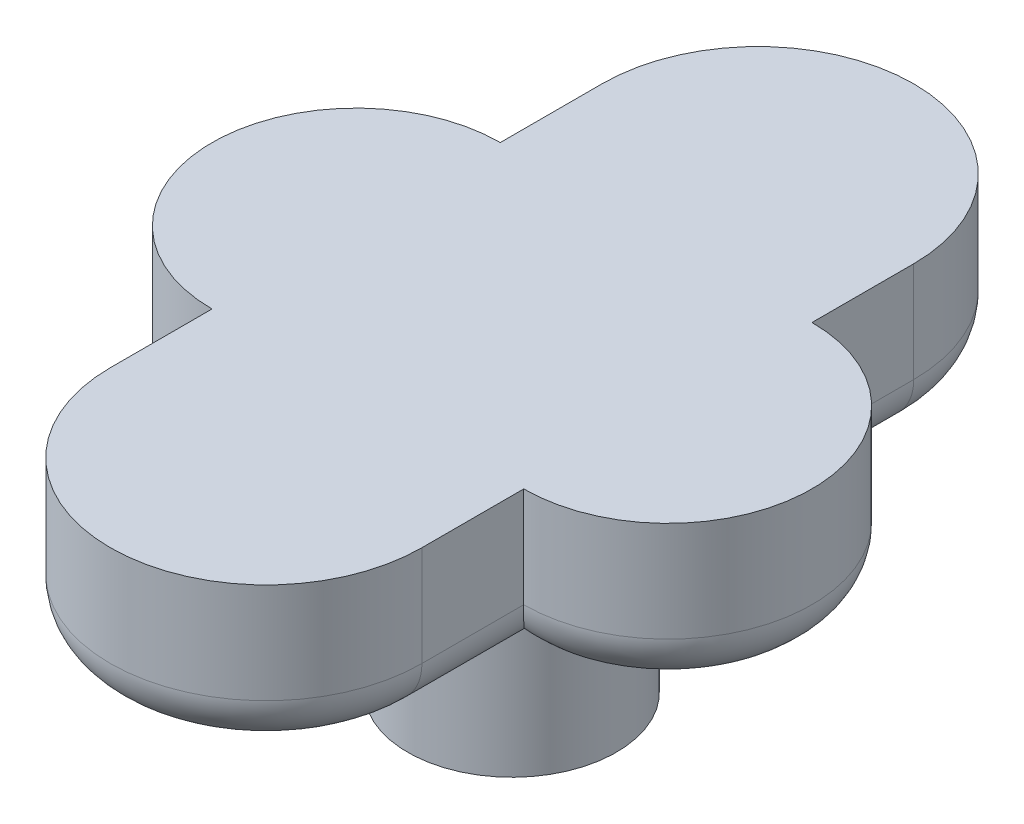
ISO-10303-21;
HEADER;
FILE_DESCRIPTION(('STEP AP214'),'2;1');
FILE_NAME('part.step','',(''),(''),'','','');
FILE_SCHEMA(('AUTOMOTIVE_DESIGN { 1 0 10303 214 1 1 1 1 }'));
ENDSEC;
DATA;
#1=APPLICATION_CONTEXT('core data for automotive mechanical design processes');
#2=APPLICATION_PROTOCOL_DEFINITION('international standard','automotive_design',2000,#1);
#3=PRODUCT_CONTEXT('',#1,'mechanical');
#4=PRODUCT('Part','Part','',(#3));
#5=PRODUCT_RELATED_PRODUCT_CATEGORY('part','',(#4));
#6=PRODUCT_DEFINITION_FORMATION('','',#4);
#7=PRODUCT_DEFINITION_CONTEXT('part definition',#1,'design');
#8=PRODUCT_DEFINITION('design','',#6,#7);
#9=PRODUCT_DEFINITION_SHAPE('','',#8);
#10=(LENGTH_UNIT() NAMED_UNIT(*) SI_UNIT(.MILLI.,.METRE.));
#11=(NAMED_UNIT(*) PLANE_ANGLE_UNIT() SI_UNIT($,.RADIAN.));
#12=(NAMED_UNIT(*) SI_UNIT($,.STERADIAN.) SOLID_ANGLE_UNIT());
#13=UNCERTAINTY_MEASURE_WITH_UNIT(LENGTH_MEASURE(1.E-05),#10,'distance_accuracy_value','');
#14=(GEOMETRIC_REPRESENTATION_CONTEXT(3) GLOBAL_UNCERTAINTY_ASSIGNED_CONTEXT((#13)) GLOBAL_UNIT_ASSIGNED_CONTEXT((#10,
#11,#12)) REPRESENTATION_CONTEXT('',''));
#15=CARTESIAN_POINT('',(0.,0.,0.));
#16=DIRECTION('',(0.,0.,1.));
#17=DIRECTION('',(1.,0.,0.));
#18=AXIS2_PLACEMENT_3D('',#15,#16,#17);
#19=CARTESIAN_POINT('',(35.1316045655547,30.,9.81329346127429));
#20=DIRECTION('',(0.,-1.,0.));
#21=DIRECTION('',(0.,0.,-1.));
#22=AXIS2_PLACEMENT_3D('',#19,#20,#21);
#23=CYLINDRICAL_SURFACE('',#22,28.7397572124763);
#24=DIRECTION('',(0.,-1.,0.));
#25=VECTOR('',#24,1.);
#26=CARTESIAN_POINT('',(35.1316045655547,30.,-18.926463751202));
#27=LINE('',#26,#25);
#28=CARTESIAN_POINT('',(35.1316045655547,30.,-18.926463751202));
#29=VERTEX_POINT('',#28);
#30=CARTESIAN_POINT('',(35.1316045655547,10.,-18.926463751202));
#31=VERTEX_POINT('',#30);
#32=EDGE_CURVE('E334',#29,#31,#27,.T.);
#33=ORIENTED_EDGE('',*,*,#32,.T.);
#34=CARTESIAN_POINT('',(35.1316045655547,10.,9.81329346127429));
#35=DIRECTION('',(0.,-1.,0.));
#36=DIRECTION('',(0.,0.,-1.));
#37=AXIS2_PLACEMENT_3D('',#34,#35,#36);
#38=CIRCLE('',#37,28.7397572124763);
#39=CARTESIAN_POINT('',(35.1316045655547,10.,38.5530506737506));
#40=VERTEX_POINT('',#39);
#41=EDGE_CURVE('E150',#31,#40,#38,.F.);
#42=ORIENTED_EDGE('',*,*,#41,.T.);
#43=DIRECTION('',(0.,-1.,0.));
#44=VECTOR('',#43,1.);
#45=CARTESIAN_POINT('',(35.1316045655547,30.,38.5530506737506));
#46=LINE('',#45,#44);
#47=CARTESIAN_POINT('',(35.1316045655547,30.,38.5530506737506));
#48=VERTEX_POINT('',#47);
#49=EDGE_CURVE('E131',#48,#40,#46,.T.);
#50=ORIENTED_EDGE('',*,*,#49,.F.);
#51=CARTESIAN_POINT('',(35.1316045655547,30.,9.81329346127429));
#52=DIRECTION('',(0.,1.,0.));
#53=DIRECTION('',(0.,0.,-1.));
#54=AXIS2_PLACEMENT_3D('',#51,#52,#53);
#55=CIRCLE('',#54,28.7397572124763);
#56=EDGE_CURVE('E138',#29,#48,#55,.T.);
#57=ORIENTED_EDGE('',*,*,#56,.F.);
#58=EDGE_LOOP('',(#33,#42,#50,#57));
#59=FACE_BOUND('',#58,.T.);
#60=ADVANCED_FACE('F35',(#59),#23,.T.);
#61=CARTESIAN_POINT('',(35.1316045655547,30.,58.8453037603243));
#62=DIRECTION('',(1.,0.,0.));
#63=DIRECTION('',(0.,0.,-1.));
#64=AXIS2_PLACEMENT_3D('',#61,#62,#63);
#65=PLANE('',#64);
#66=ORIENTED_EDGE('',*,*,#49,.T.);
#67=DIRECTION('',(0.,0.,1.));
#68=VECTOR('',#67,1.);
#69=CARTESIAN_POINT('',(35.1316045655547,10.,58.8453037603243));
#70=LINE('',#69,#68);
#71=CARTESIAN_POINT('',(35.1316045655547,10.,58.8453037603243));
#72=VERTEX_POINT('',#71);
#73=EDGE_CURVE('E165',#40,#72,#70,.T.);
#74=ORIENTED_EDGE('',*,*,#73,.T.);
#75=DIRECTION('',(0.,-1.,0.));
#76=VECTOR('',#75,1.);
#77=CARTESIAN_POINT('',(35.1316045655547,30.,58.8453037603243));
#78=LINE('',#77,#76);
#79=CARTESIAN_POINT('',(35.1316045655547,30.,58.8453037603243));
#80=VERTEX_POINT('',#79);
#81=EDGE_CURVE('E134',#80,#72,#78,.T.);
#82=ORIENTED_EDGE('',*,*,#81,.F.);
#83=DIRECTION('',(0.,0.,1.));
#84=VECTOR('',#83,1.);
#85=CARTESIAN_POINT('',(35.1316045655547,30.,58.8453037603243));
#86=LINE('',#85,#84);
#87=EDGE_CURVE('E126',#48,#80,#86,.T.);
#88=ORIENTED_EDGE('',*,*,#87,.F.);
#89=EDGE_LOOP('',(#66,#74,#82,#88));
#90=FACE_BOUND('',#89,.T.);
#91=ADVANCED_FACE('F128',(#90),#65,.F.);
#92=CARTESIAN_POINT('',(66.2057612196695,30.,58.8453037603243));
#93=DIRECTION('',(0.,-1.,0.));
#94=DIRECTION('',(0.,0.,-1.));
#95=AXIS2_PLACEMENT_3D('',#92,#93,#94);
#96=CYLINDRICAL_SURFACE('',#95,31.0741566541148);
#97=ORIENTED_EDGE('',*,*,#81,.T.);
#98=CARTESIAN_POINT('',(66.2057612196695,10.,58.8453037603243));
#99=DIRECTION('',(0.,-1.,0.));
#100=DIRECTION('',(0.,0.,-1.));
#101=AXIS2_PLACEMENT_3D('',#98,#99,#100);
#102=CIRCLE('',#101,31.0741566541148);
#103=CARTESIAN_POINT('',(97.2799178737842,10.,58.8453037603243));
#104=VERTEX_POINT('',#103);
#105=EDGE_CURVE('E190',#72,#104,#102,.F.);
#106=ORIENTED_EDGE('',*,*,#105,.T.);
#107=DIRECTION('',(0.,-1.,0.));
#108=VECTOR('',#107,1.);
#109=CARTESIAN_POINT('',(97.2799178737842,30.,58.8453037603243));
#110=LINE('',#109,#108);
#111=CARTESIAN_POINT('',(97.2799178737842,30.,58.8453037603243));
#112=VERTEX_POINT('',#111);
#113=EDGE_CURVE('E156',#112,#104,#110,.T.);
#114=ORIENTED_EDGE('',*,*,#113,.F.);
#115=CARTESIAN_POINT('',(66.2057612196695,30.,58.8453037603243));
#116=DIRECTION('',(0.,1.,0.));
#117=DIRECTION('',(0.,0.,-1.));
#118=AXIS2_PLACEMENT_3D('',#115,#116,#117);
#119=CIRCLE('',#118,31.0741566541148);
#120=EDGE_CURVE('E137',#80,#112,#119,.T.);
#121=ORIENTED_EDGE('',*,*,#120,.F.);
#122=EDGE_LOOP('',(#97,#106,#114,#121));
#123=FACE_BOUND('',#122,.T.);
#124=ADVANCED_FACE('F294',(#123),#96,.T.);
#125=CARTESIAN_POINT('',(97.2799178737843,30.,58.8453037603243));
#126=DIRECTION('',(-1.,0.,0.));
#127=DIRECTION('',(0.,0.,1.));
#128=AXIS2_PLACEMENT_3D('',#125,#126,#127);
#129=PLANE('',#128);
#130=ORIENTED_EDGE('',*,*,#113,.T.);
#131=DIRECTION('',(0.,0.,-1.));
#132=VECTOR('',#131,1.);
#133=CARTESIAN_POINT('',(97.2799178737843,10.,38.5530506737506));
#134=LINE('',#133,#132);
#135=CARTESIAN_POINT('',(97.2799178737843,10.,38.5530506737506));
#136=VERTEX_POINT('',#135);
#137=EDGE_CURVE('E184',#104,#136,#134,.T.);
#138=ORIENTED_EDGE('',*,*,#137,.T.);
#139=DIRECTION('',(0.,-1.,0.));
#140=VECTOR('',#139,1.);
#141=CARTESIAN_POINT('',(97.2799178737843,30.,38.5530506737506));
#142=LINE('',#141,#140);
#143=CARTESIAN_POINT('',(97.2799178737843,30.,38.5530506737506));
#144=VERTEX_POINT('',#143);
#145=EDGE_CURVE('E343',#144,#136,#142,.T.);
#146=ORIENTED_EDGE('',*,*,#145,.F.);
#147=DIRECTION('',(0.,0.,-1.));
#148=VECTOR('',#147,1.);
#149=CARTESIAN_POINT('',(97.2799178737843,30.,58.8453037603243));
#150=LINE('',#149,#148);
#151=EDGE_CURVE('E325',#112,#144,#150,.T.);
#152=ORIENTED_EDGE('',*,*,#151,.F.);
#153=EDGE_LOOP('',(#130,#138,#146,#152));
#154=FACE_BOUND('',#153,.T.);
#155=ADVANCED_FACE('F348',(#154),#129,.F.);
#156=CARTESIAN_POINT('',(97.2799178737843,30.,9.81329346127428));
#157=DIRECTION('',(0.,-1.,0.));
#158=DIRECTION('',(0.,0.,-1.));
#159=AXIS2_PLACEMENT_3D('',#156,#157,#158);
#160=CYLINDRICAL_SURFACE('',#159,28.7397572124763);
#161=ORIENTED_EDGE('',*,*,#145,.T.);
#162=CARTESIAN_POINT('',(97.2799178737843,10.,9.81329346127428));
#163=DIRECTION('',(0.,-1.,0.));
#164=DIRECTION('',(0.,0.,-1.));
#165=AXIS2_PLACEMENT_3D('',#162,#163,#164);
#166=CIRCLE('',#165,28.7397572124763);
#167=CARTESIAN_POINT('',(97.2799178737843,10.,-18.926463751202));
#168=VERTEX_POINT('',#167);
#169=EDGE_CURVE('E44',#136,#168,#166,.F.);
#170=ORIENTED_EDGE('',*,*,#169,.T.);
#171=DIRECTION('',(0.,-1.,0.));
#172=VECTOR('',#171,1.);
#173=CARTESIAN_POINT('',(97.2799178737843,30.,-18.926463751202));
#174=LINE('',#173,#172);
#175=CARTESIAN_POINT('',(97.2799178737843,30.,-18.926463751202));
#176=VERTEX_POINT('',#175);
#177=EDGE_CURVE('E341',#176,#168,#174,.T.);
#178=ORIENTED_EDGE('',*,*,#177,.F.);
#179=CARTESIAN_POINT('',(97.2799178737843,30.,9.81329346127428));
#180=DIRECTION('',(0.,1.,0.));
#181=DIRECTION('',(0.,0.,-1.));
#182=AXIS2_PLACEMENT_3D('',#179,#180,#181);
#183=CIRCLE('',#182,28.7397572124763);
#184=EDGE_CURVE('E327',#144,#176,#183,.T.);
#185=ORIENTED_EDGE('',*,*,#184,.F.);
#186=EDGE_LOOP('',(#161,#170,#178,#185));
#187=FACE_BOUND('',#186,.T.);
#188=ADVANCED_FACE('F352',(#187),#160,.T.);
#189=CARTESIAN_POINT('',(97.2799178737843,30.,-18.926463751202));
#190=DIRECTION('',(-1.,0.,0.));
#191=DIRECTION('',(0.,0.,1.));
#192=AXIS2_PLACEMENT_3D('',#189,#190,#191);
#193=PLANE('',#192);
#194=ORIENTED_EDGE('',*,*,#177,.T.);
#195=DIRECTION('',(0.,0.,-1.));
#196=VECTOR('',#195,1.);
#197=CARTESIAN_POINT('',(97.2799178737842,10.,-39.2187168377758));
#198=LINE('',#197,#196);
#199=CARTESIAN_POINT('',(97.2799178737842,10.,-39.2187168377758));
#200=VERTEX_POINT('',#199);
#201=EDGE_CURVE('E11',#168,#200,#198,.T.);
#202=ORIENTED_EDGE('',*,*,#201,.T.);
#203=DIRECTION('',(0.,-1.,0.));
#204=VECTOR('',#203,1.);
#205=CARTESIAN_POINT('',(97.2799178737842,30.,-39.2187168377758));
#206=LINE('',#205,#204);
#207=CARTESIAN_POINT('',(97.2799178737842,30.,-39.2187168377758));
#208=VERTEX_POINT('',#207);
#209=EDGE_CURVE('E339',#208,#200,#206,.T.);
#210=ORIENTED_EDGE('',*,*,#209,.F.);
#211=DIRECTION('',(0.,0.,-1.));
#212=VECTOR('',#211,1.);
#213=CARTESIAN_POINT('',(97.2799178737843,30.,-18.926463751202));
#214=LINE('',#213,#212);
#215=EDGE_CURVE('E329',#176,#208,#214,.T.);
#216=ORIENTED_EDGE('',*,*,#215,.F.);
#217=EDGE_LOOP('',(#194,#202,#210,#216));
#218=FACE_BOUND('',#217,.T.);
#219=ADVANCED_FACE('F354',(#218),#193,.F.);
#220=CARTESIAN_POINT('',(66.2057612196695,30.,-39.2187168377758));
#221=DIRECTION('',(0.,-1.,0.));
#222=DIRECTION('',(0.,0.,-1.));
#223=AXIS2_PLACEMENT_3D('',#220,#221,#222);
#224=CYLINDRICAL_SURFACE('',#223,31.0741566541148);
#225=ORIENTED_EDGE('',*,*,#209,.T.);
#226=CARTESIAN_POINT('',(66.2057612196695,10.,-39.2187168377758));
#227=DIRECTION('',(0.,-1.,0.));
#228=DIRECTION('',(0.,0.,-1.));
#229=AXIS2_PLACEMENT_3D('',#226,#227,#228);
#230=CIRCLE('',#229,31.0741566541148);
#231=CARTESIAN_POINT('',(35.1316045655547,10.,-39.2187168377757));
#232=VERTEX_POINT('',#231);
#233=EDGE_CURVE('E188',#200,#232,#230,.F.);
#234=ORIENTED_EDGE('',*,*,#233,.T.);
#235=DIRECTION('',(0.,-1.,0.));
#236=VECTOR('',#235,1.);
#237=CARTESIAN_POINT('',(35.1316045655547,30.,-39.2187168377757));
#238=LINE('',#237,#236);
#239=CARTESIAN_POINT('',(35.1316045655547,30.,-39.2187168377757));
#240=VERTEX_POINT('',#239);
#241=EDGE_CURVE('E336',#240,#232,#238,.T.);
#242=ORIENTED_EDGE('',*,*,#241,.F.);
#243=CARTESIAN_POINT('',(66.2057612196695,30.,-39.2187168377758));
#244=DIRECTION('',(0.,1.,0.));
#245=DIRECTION('',(0.,0.,-1.));
#246=AXIS2_PLACEMENT_3D('',#243,#244,#245);
#247=CIRCLE('',#246,31.0741566541148);
#248=EDGE_CURVE('E331',#208,#240,#247,.T.);
#249=ORIENTED_EDGE('',*,*,#248,.F.);
#250=EDGE_LOOP('',(#225,#234,#242,#249));
#251=FACE_BOUND('',#250,.T.);
#252=ADVANCED_FACE('F358',(#251),#224,.T.);
#253=CARTESIAN_POINT('',(35.1316045655547,30.,-18.926463751202));
#254=DIRECTION('',(1.,0.,0.));
#255=DIRECTION('',(0.,0.,-1.));
#256=AXIS2_PLACEMENT_3D('',#253,#254,#255);
#257=PLANE('',#256);
#258=ORIENTED_EDGE('',*,*,#241,.T.);
#259=DIRECTION('',(0.,0.,1.));
#260=VECTOR('',#259,1.);
#261=CARTESIAN_POINT('',(35.1316045655547,10.,-18.926463751202));
#262=LINE('',#261,#260);
#263=EDGE_CURVE('E186',#232,#31,#262,.T.);
#264=ORIENTED_EDGE('',*,*,#263,.T.);
#265=ORIENTED_EDGE('',*,*,#32,.F.);
#266=DIRECTION('',(0.,0.,1.));
#267=VECTOR('',#266,1.);
#268=CARTESIAN_POINT('',(35.1316045655547,30.,-18.926463751202));
#269=LINE('',#268,#267);
#270=EDGE_CURVE('E143',#240,#29,#269,.T.);
#271=ORIENTED_EDGE('',*,*,#270,.F.);
#272=EDGE_LOOP('',(#258,#264,#265,#271));
#273=FACE_BOUND('',#272,.T.);
#274=ADVANCED_FACE('F360',(#273),#257,.F.);
#275=CARTESIAN_POINT('',(35.1316045655547,30.,9.81329346127429));
#276=DIRECTION('',(0.,-1.,0.));
#277=DIRECTION('',(0.,0.,-1.));
#278=AXIS2_PLACEMENT_3D('',#275,#276,#277);
#279=PLANE('',#278);
#280=ORIENTED_EDGE('',*,*,#56,.T.);
#281=ORIENTED_EDGE('',*,*,#87,.T.);
#282=ORIENTED_EDGE('',*,*,#120,.T.);
#283=ORIENTED_EDGE('',*,*,#151,.T.);
#284=ORIENTED_EDGE('',*,*,#184,.T.);
#285=ORIENTED_EDGE('',*,*,#215,.T.);
#286=ORIENTED_EDGE('',*,*,#248,.T.);
#287=ORIENTED_EDGE('',*,*,#270,.T.);
#288=EDGE_LOOP('',(#280,#281,#282,#283,#284,#285,#286,#287));
#289=FACE_BOUND('',#288,.T.);
#290=ADVANCED_FACE('F141',(#289),#279,.F.);
#291=CARTESIAN_POINT('',(35.1316045655547,0.,9.81329346127429));
#292=DIRECTION('',(0.,-1.,0.));
#293=DIRECTION('',(0.,0.,-1.));
#294=AXIS2_PLACEMENT_3D('',#291,#292,#293);
#295=PLANE('',#294);
#296=CARTESIAN_POINT('',(66.2057612196695,0.,58.8453037603243));
#297=DIRECTION('',(0.,-1.,0.));
#298=DIRECTION('',(0.,0.,-1.));
#299=AXIS2_PLACEMENT_3D('',#296,#297,#298);
#300=CIRCLE('',#299,21.0741566541148);
#301=CARTESIAN_POINT('',(87.2799178737843,0.,58.8453037603243));
#302=VERTEX_POINT('',#301);
#303=CARTESIAN_POINT('',(45.1316045655547,0.,58.8453037603243));
#304=VERTEX_POINT('',#303);
#305=EDGE_CURVE('E179',#302,#304,#300,.T.);
#306=ORIENTED_EDGE('',*,*,#305,.T.);
#307=DIRECTION('',(0.,0.,1.));
#308=VECTOR('',#307,1.);
#309=CARTESIAN_POINT('',(45.1316045655547,0.,38.5530506737506));
#310=LINE('',#309,#308);
#311=CARTESIAN_POINT('',(45.1316045655547,0.,25.6619053999444));
#312=VERTEX_POINT('',#311);
#313=EDGE_CURVE('E181',#304,#312,#310,.F.);
#314=ORIENTED_EDGE('',*,*,#313,.T.);
#315=CARTESIAN_POINT('',(35.1316045655547,0.,9.81329346127429));
#316=DIRECTION('',(0.,-1.,0.));
#317=DIRECTION('',(0.,0.,-1.));
#318=AXIS2_PLACEMENT_3D('',#315,#316,#317);
#319=CIRCLE('',#318,18.7397572124763);
#320=CARTESIAN_POINT('',(45.1316045655547,0.,-6.03531847739586));
#321=VERTEX_POINT('',#320);
#322=EDGE_CURVE('E177',#312,#321,#319,.T.);
#323=ORIENTED_EDGE('',*,*,#322,.T.);
#324=DIRECTION('',(0.,0.,1.));
#325=VECTOR('',#324,1.);
#326=CARTESIAN_POINT('',(45.1316045655547,0.,-39.2187168377757));
#327=LINE('',#326,#325);
#328=CARTESIAN_POINT('',(45.1316045655547,0.,-39.2187168377757));
#329=VERTEX_POINT('',#328);
#330=EDGE_CURVE('E173',#321,#329,#327,.F.);
#331=ORIENTED_EDGE('',*,*,#330,.T.);
#332=CARTESIAN_POINT('',(66.2057612196695,0.,-39.2187168377758));
#333=DIRECTION('',(0.,-1.,0.));
#334=DIRECTION('',(0.,0.,-1.));
#335=AXIS2_PLACEMENT_3D('',#332,#333,#334);
#336=CIRCLE('',#335,21.0741566541148);
#337=CARTESIAN_POINT('',(87.2799178737843,0.,-39.2187168377758));
#338=VERTEX_POINT('',#337);
#339=EDGE_CURVE('E171',#329,#338,#336,.T.);
#340=ORIENTED_EDGE('',*,*,#339,.T.);
#341=DIRECTION('',(0.,0.,-1.));
#342=VECTOR('',#341,1.);
#343=CARTESIAN_POINT('',(87.2799178737843,0.,-18.926463751202));
#344=LINE('',#343,#342);
#345=CARTESIAN_POINT('',(87.2799178737843,0.,-6.03531847739587));
#346=VERTEX_POINT('',#345);
#347=EDGE_CURVE('E167',#338,#346,#344,.F.);
#348=ORIENTED_EDGE('',*,*,#347,.T.);
#349=CARTESIAN_POINT('',(97.2799178737843,0.,9.81329346127428));
#350=DIRECTION('',(0.,-1.,0.));
#351=DIRECTION('',(0.,0.,-1.));
#352=AXIS2_PLACEMENT_3D('',#349,#350,#351);
#353=CIRCLE('',#352,18.7397572124763);
#354=CARTESIAN_POINT('',(87.2799178737843,0.,25.6619053999444));
#355=VERTEX_POINT('',#354);
#356=EDGE_CURVE('E169',#346,#355,#353,.T.);
#357=ORIENTED_EDGE('',*,*,#356,.T.);
#358=DIRECTION('',(0.,0.,-1.));
#359=VECTOR('',#358,1.);
#360=CARTESIAN_POINT('',(87.2799178737843,0.,58.8453037603243));
#361=LINE('',#360,#359);
#362=EDGE_CURVE('E175',#355,#302,#361,.F.);
#363=ORIENTED_EDGE('',*,*,#362,.T.);
#364=EDGE_LOOP('',(#306,#314,#323,#331,#340,#348,#357,#363));
#365=FACE_BOUND('',#364,.T.);
#366=CARTESIAN_POINT('',(66.2057612196695,0.,9.8132934612743));
#367=DIRECTION('',(0.,-1.,0.));
#368=DIRECTION('',(0.,0.,-1.));
#369=AXIS2_PLACEMENT_3D('',#366,#367,#368);
#370=CIRCLE('',#369,25.8);
#371=CARTESIAN_POINT('',(66.2057612196695,0.,-15.9867065387257));
#372=VERTEX_POINT('',#371);
#373=EDGE_CURVE('E162',#372,#372,#370,.F.);
#374=ORIENTED_EDGE('',*,*,#373,.T.);
#375=EDGE_LOOP('',(#374));
#376=FACE_BOUND('',#375,.T.);
#377=ADVANCED_FACE('F269',(#365,#376),#295,.T.);
#378=CARTESIAN_POINT('',(66.2057612196695,-35.,9.8132934612743));
#379=DIRECTION('',(0.,-1.,0.));
#380=DIRECTION('',(0.,0.,-1.));
#381=AXIS2_PLACEMENT_3D('',#378,#379,#380);
#382=PLANE('',#381);
#383=CARTESIAN_POINT('',(66.2057612196695,-35.,9.8132934612743));
#384=DIRECTION('',(0.,-1.,0.));
#385=DIRECTION('',(0.,0.,-1.));
#386=AXIS2_PLACEMENT_3D('',#383,#384,#385);
#387=CIRCLE('',#386,20.8);
#388=CARTESIAN_POINT('',(66.2057612196695,-35.,-10.9867065387257));
#389=VERTEX_POINT('',#388);
#390=EDGE_CURVE('E147',#389,#389,#387,.T.);
#391=ORIENTED_EDGE('',*,*,#390,.T.);
#392=EDGE_LOOP('',(#391));
#393=FACE_BOUND('',#392,.T.);
#394=CARTESIAN_POINT('',(66.2057612196695,-35.,9.8132934612743));
#395=DIRECTION('',(0.,-1.,0.));
#396=DIRECTION('',(0.,0.,-1.));
#397=AXIS2_PLACEMENT_3D('',#394,#395,#396);
#398=CIRCLE('',#397,10.8);
#399=CARTESIAN_POINT('',(66.2057612196695,-35.,-0.986706538725707));
#400=VERTEX_POINT('',#399);
#401=EDGE_CURVE('E257',#400,#400,#398,.T.);
#402=ORIENTED_EDGE('',*,*,#401,.F.);
#403=EDGE_LOOP('',(#402));
#404=FACE_BOUND('',#403,.T.);
#405=ADVANCED_FACE('F315',(#393,#404),#382,.T.);
#406=CARTESIAN_POINT('',(66.2057612196695,-35.,9.8132934612743));
#407=DIRECTION('',(0.,1.,0.));
#408=DIRECTION('',(0.,0.,1.));
#409=AXIS2_PLACEMENT_3D('',#406,#407,#408);
#410=CYLINDRICAL_SURFACE('',#409,20.8);
#411=CARTESIAN_POINT('',(66.2057612196695,-5.,9.8132934612743));
#412=DIRECTION('',(0.,-1.,0.));
#413=DIRECTION('',(0.,0.,-1.));
#414=AXIS2_PLACEMENT_3D('',#411,#412,#413);
#415=CIRCLE('',#414,20.8);
#416=CARTESIAN_POINT('',(66.2057612196695,-5.,-10.9867065387257));
#417=VERTEX_POINT('',#416);
#418=EDGE_CURVE('E154',#417,#417,#415,.T.);
#419=ORIENTED_EDGE('',*,*,#418,.T.);
#420=EDGE_LOOP('',(#419));
#421=FACE_BOUND('',#420,.T.);
#422=ORIENTED_EDGE('',*,*,#390,.F.);
#423=EDGE_LOOP('',(#422));
#424=FACE_BOUND('',#423,.T.);
#425=ADVANCED_FACE('F312',(#421,#424),#410,.T.);
#426=CARTESIAN_POINT('',(66.2057612196695,-35.,9.8132934612743));
#427=DIRECTION('',(0.,1.,0.));
#428=DIRECTION('',(0.,0.,1.));
#429=AXIS2_PLACEMENT_3D('',#426,#427,#428);
#430=CYLINDRICAL_SURFACE('',#429,10.8);
#431=ORIENTED_EDGE('',*,*,#401,.T.);
#432=EDGE_LOOP('',(#431));
#433=FACE_BOUND('',#432,.T.);
#434=CARTESIAN_POINT('',(66.2057612196695,0.,9.8132934612743));
#435=DIRECTION('',(0.,-1.,0.));
#436=DIRECTION('',(0.,0.,-1.));
#437=AXIS2_PLACEMENT_3D('',#434,#435,#436);
#438=CIRCLE('',#437,10.8);
#439=CARTESIAN_POINT('',(66.2057612196695,0.,-0.986706538725707));
#440=VERTEX_POINT('',#439);
#441=EDGE_CURVE('E151',#440,#440,#438,.F.);
#442=ORIENTED_EDGE('',*,*,#441,.T.);
#443=EDGE_LOOP('',(#442));
#444=FACE_BOUND('',#443,.T.);
#445=ADVANCED_FACE('F305',(#433,#444),#430,.F.);
#446=ORIENTED_EDGE('',*,*,#441,.F.);
#447=EDGE_LOOP('',(#446));
#448=FACE_BOUND('',#447,.T.);
#449=ADVANCED_FACE('F299',(#448),#295,.T.);
#450=CARTESIAN_POINT('',(66.2057612196695,-5.,9.8132934612743));
#451=DIRECTION('',(0.,-1.,0.));
#452=DIRECTION('',(0.,0.,-1.));
#453=AXIS2_PLACEMENT_3D('',#450,#451,#452);
#454=TOROIDAL_SURFACE('',#453,25.8,5.);
#455=ORIENTED_EDGE('',*,*,#373,.F.);
#456=EDGE_LOOP('',(#455));
#457=FACE_BOUND('',#456,.T.);
#458=ORIENTED_EDGE('',*,*,#418,.F.);
#459=EDGE_LOOP('',(#458));
#460=FACE_BOUND('',#459,.T.);
#461=ADVANCED_FACE('F297',(#457,#460),#454,.F.);
#462=CARTESIAN_POINT('',(87.2799178737843,10.,-18.926463751202));
#463=DIRECTION('',(0.,0.,1.));
#464=DIRECTION('',(1.,0.,0.));
#465=AXIS2_PLACEMENT_3D('',#462,#463,#464);
#466=CYLINDRICAL_SURFACE('',#465,10.);
#467=CARTESIAN_POINT('',(97.2799178737843,10.,-18.926463751202));
#468=CARTESIAN_POINT('',(97.2799193907443,9.88965889970209,-18.9264647124941));
#469=CARTESIAN_POINT('',(97.2780910630216,9.77933440282746,-18.9246370088713));
#470=CARTESIAN_POINT('',(97.2707944060473,9.55893209216642,-18.9173391717921));
#471=CARTESIAN_POINT('',(97.2653262640972,9.44885426597902,-18.911869225762));
#472=CARTESIAN_POINT('',(97.2435042250929,9.11948807709472,-18.8900309612564));
#473=CARTESIAN_POINT('',(97.221732642663,8.90087127089135,-18.8682341600714));
#474=CARTESIAN_POINT('',(97.164415655049,8.46904643623617,-18.8107426799077));
#475=CARTESIAN_POINT('',(97.1289745433944,8.25581017466788,-18.7751532242177));
#476=CARTESIAN_POINT('',(97.0450180646143,7.83460536465201,-18.6906273464972));
#477=CARTESIAN_POINT('',(96.9965012813114,7.62663738946364,-18.6416894787429));
#478=CARTESIAN_POINT('',(96.8874443808524,7.21790179252255,-18.531326684869));
#479=CARTESIAN_POINT('',(96.8269351682865,7.01711719740858,-18.4699338459028));
#480=CARTESIAN_POINT('',(96.6948239298771,6.62320805771024,-18.33536999417));
#481=CARTESIAN_POINT('',(96.6232169547916,6.43008697930732,-18.2621937258056));
#482=CARTESIAN_POINT('',(96.4699295926678,6.05217460498735,-18.1048387422347));
#483=CARTESIAN_POINT('',(96.3882350149068,5.86739555453768,-18.020644517349));
#484=CARTESIAN_POINT('',(96.2159776727055,5.50703426986961,-17.8422094544058));
#485=CARTESIAN_POINT('',(96.1254129646019,5.33145406433955,-17.7479664140031));
#486=CARTESIAN_POINT('',(95.9028892942383,4.92906464892685,-17.5150921002498));
#487=CARTESIAN_POINT('',(95.7676732607902,4.70627495799443,-17.3726040524557));
#488=CARTESIAN_POINT('',(95.4856140894327,4.2787954634947,-17.0727702056905));
#489=CARTESIAN_POINT('',(95.3387674785699,4.07411110519371,-16.9154199660671));
#490=CARTESIAN_POINT('',(95.0356765338332,3.68259826235251,-16.5875141831044));
#491=CARTESIAN_POINT('',(94.8794211309667,3.49579150606491,-16.4169430154694));
#492=CARTESIAN_POINT('',(94.5598141024346,3.13994753635182,-16.06438996187));
#493=CARTESIAN_POINT('',(94.3964622275952,2.97091094759251,-15.8824076751348));
#494=CARTESIAN_POINT('',(93.9951069098771,2.58289685413632,-15.4302112504763));
#495=CARTESIAN_POINT('',(93.7544390113329,2.37257644405804,-15.1549112272955));
#496=CARTESIAN_POINT('',(93.2670134258912,1.98427459132093,-14.5874126559428));
#497=CARTESIAN_POINT('',(93.0202532394578,1.80630668131459,-14.2952071034565));
#498=CARTESIAN_POINT('',(92.5239194196859,1.48009577647482,-13.6960881782608));
#499=CARTESIAN_POINT('',(92.2743419084904,1.33190091763351,-13.3891519662947));
#500=CARTESIAN_POINT('',(91.7757523397373,1.06312837543462,-12.7631307159385));
#501=CARTESIAN_POINT('',(91.5267402547518,0.942549322869582,-12.4440462807795));
#502=CARTESIAN_POINT('',(90.9206465090286,0.678080819337267,-11.649845006445));
#503=CARTESIAN_POINT('',(90.5651589112086,0.547972210797901,-11.1689027467448));
#504=CARTESIAN_POINT('',(89.8660799915457,0.333277175479118,-10.1884682492632));
#505=CARTESIAN_POINT('',(89.5224950847241,0.248714949722002,-9.68896630018801));
#506=CARTESIAN_POINT('',(88.8522018833729,0.118485095685317,-8.67479743212664));
#507=CARTESIAN_POINT('',(88.5254749374236,0.0727735774388627,-8.16014830717865));
#508=CARTESIAN_POINT('',(87.8921388920418,0.0136968343832924,-7.11716663989907));
#509=CARTESIAN_POINT('',(87.585519867427,0.000315532816611958,-6.58884103059651));
#510=CARTESIAN_POINT('',(87.2869207587096,1.83859496014349E-06,-6.04801364711642));
#511=CARTESIAN_POINT('',(87.2834185026028,4.43477823527929E-10,-6.04166649549627));
#512=CARTESIAN_POINT('',(87.2799178737843,0.,-6.03531847739587));
#513=B_SPLINE_CURVE_WITH_KNOTS('',3,(#467,#468,#469,#470,#471,#472,#473,#474,#475,#476,#477,
#478,#479,#480,#481,#482,#483,#484,#485,#486,#487,#488,#489,#490,#491,#492,#493,#494,#495,#496,
#497,#498,#499,#500,#501,#502,#503,#504,#505,#506,#507,#508,#509,#510,#511,#512),.UNSPECIFIED.,
.F.,.F.,(4,2,2,2,2,2,2,2,2,2,2,2,2,2,2,2,2,2,2,2,2,2,4),(0.,0.330960188218451,0.661903346856519,
1.32320477723487,1.9795574588252,2.63598125612475,3.29073493841572,3.94578146433373,
4.60176020485071,5.25788300937751,6.14762742345428,7.03763852902212,7.92871796122109,
8.81982870664181,10.0834008102855,11.3475002405101,12.6136272590786,13.8796914887499,
15.7132990679685,17.5478799738896,19.3803855732037,21.2119797397995,21.2337275927506),.UNSPECIFIED.);
#514=EDGE_CURVE('E248',#346,#168,#513,.F.);
#515=ORIENTED_EDGE('',*,*,#514,.F.);
#516=ORIENTED_EDGE('',*,*,#347,.F.);
#517=CARTESIAN_POINT('',(87.2799178737843,10.,-39.2187168377758));
#518=DIRECTION('',(0.,0.,-1.));
#519=DIRECTION('',(-1.,0.,0.));
#520=AXIS2_PLACEMENT_3D('',#517,#518,#519);
#521=CIRCLE('',#520,10.);
#522=EDGE_CURVE('E39',#200,#338,#521,.T.);
#523=ORIENTED_EDGE('',*,*,#522,.F.);
#524=ORIENTED_EDGE('',*,*,#201,.F.);
#525=EDGE_LOOP('',(#515,#516,#523,#524));
#526=FACE_BOUND('',#525,.T.);
#527=ADVANCED_FACE('F245',(#526),#466,.T.);
#528=CARTESIAN_POINT('',(66.2057612196695,10.,-39.2187168377758));
#529=DIRECTION('',(0.,-1.,0.));
#530=DIRECTION('',(0.,0.,-1.));
#531=AXIS2_PLACEMENT_3D('',#528,#529,#530);
#532=TOROIDAL_SURFACE('',#531,21.0741566541148,10.);
#533=ORIENTED_EDGE('',*,*,#522,.T.);
#534=ORIENTED_EDGE('',*,*,#339,.F.);
#535=CARTESIAN_POINT('',(45.1316045655547,10.,-39.2187168377757));
#536=DIRECTION('',(0.,0.,1.));
#537=DIRECTION('',(1.,0.,0.));
#538=AXIS2_PLACEMENT_3D('',#535,#536,#537);
#539=CIRCLE('',#538,10.);
#540=EDGE_CURVE('E241',#232,#329,#539,.T.);
#541=ORIENTED_EDGE('',*,*,#540,.F.);
#542=ORIENTED_EDGE('',*,*,#233,.F.);
#543=EDGE_LOOP('',(#533,#534,#541,#542));
#544=FACE_BOUND('',#543,.T.);
#545=ADVANCED_FACE('F37',(#544),#532,.T.);
#546=CARTESIAN_POINT('',(97.2799178737843,10.,9.81329346127428));
#547=DIRECTION('',(0.,-1.,0.));
#548=DIRECTION('',(0.,0.,-1.));
#549=AXIS2_PLACEMENT_3D('',#546,#547,#548);
#550=TOROIDAL_SURFACE('',#549,18.7397572124763,10.);
#551=ORIENTED_EDGE('',*,*,#514,.T.);
#552=ORIENTED_EDGE('',*,*,#169,.F.);
#553=CARTESIAN_POINT('',(97.2799178737843,10.,38.5530506737506));
#554=CARTESIAN_POINT('',(97.2799193907443,9.88965889970209,38.5530516350427));
#555=CARTESIAN_POINT('',(97.2780910630216,9.77933440282746,38.5512239314198));
#556=CARTESIAN_POINT('',(97.2707944060473,9.55893209216642,38.5439260943406));
#557=CARTESIAN_POINT('',(97.2653262640972,9.44885426597902,38.5384561483106));
#558=CARTESIAN_POINT('',(97.2435042250929,9.1194880770947,38.5166178838049));
#559=CARTESIAN_POINT('',(97.221732642663,8.90087127089133,38.49482108262));
#560=CARTESIAN_POINT('',(97.164415655049,8.46904643623615,38.4373296024562));
#561=CARTESIAN_POINT('',(97.1289745433944,8.25581017466787,38.4017401467662));
#562=CARTESIAN_POINT('',(97.0450180646143,7.83460536465201,38.3172142690458));
#563=CARTESIAN_POINT('',(96.9965012813114,7.62663738946364,38.2682764012914));
#564=CARTESIAN_POINT('',(96.8874443808524,7.21790179252256,38.1579136074176));
#565=CARTESIAN_POINT('',(96.8269351682865,7.0171171974086,38.0965207684514));
#566=CARTESIAN_POINT('',(96.6948239298771,6.62320805771028,37.9619569167186));
#567=CARTESIAN_POINT('',(96.6232169547916,6.43008697930736,37.8887806483541));
#568=CARTESIAN_POINT('',(96.4699295926678,6.05217460498739,37.7314256647833));
#569=CARTESIAN_POINT('',(96.3882350149068,5.86739555453772,37.6472314398976));
#570=CARTESIAN_POINT('',(96.2159776727055,5.50703426986963,37.4687963769543));
#571=CARTESIAN_POINT('',(96.1254129646019,5.33145406433956,37.3745533365517));
#572=CARTESIAN_POINT('',(95.9028892942383,4.9290646489268,37.1416790227984));
#573=CARTESIAN_POINT('',(95.7676732607901,4.70627495799434,36.9991909750042));
#574=CARTESIAN_POINT('',(95.4856140894326,4.27879546349453,36.6993571282389));
#575=CARTESIAN_POINT('',(95.3387674785697,4.07411110519351,36.5420068886155));
#576=CARTESIAN_POINT('',(95.035676533833,3.68259826235232,36.2141011056528));
#577=CARTESIAN_POINT('',(94.8794211309666,3.49579150606476,36.0435299380178));
#578=CARTESIAN_POINT('',(94.5598141024345,3.13994753635175,35.6909768844185));
#579=CARTESIAN_POINT('',(94.3964622275951,2.97091094759247,35.5089945976833));
#580=CARTESIAN_POINT('',(93.9951069098774,2.58289685413653,35.0567981730251));
#581=CARTESIAN_POINT('',(93.7544390113334,2.37257644405843,34.7814981498446));
#582=CARTESIAN_POINT('',(93.2670134258921,1.9842745913216,34.2139995784924));
#583=CARTESIAN_POINT('',(93.0202532394589,1.80630668131535,33.9217940260063));
#584=CARTESIAN_POINT('',(92.5239194196869,1.48009577647543,33.3226751008106));
#585=CARTESIAN_POINT('',(92.2743419084912,1.33190091763393,33.0157388888442));
#586=CARTESIAN_POINT('',(91.7757523397376,1.06312837543478,32.3897176384875));
#587=CARTESIAN_POINT('',(91.5267402547519,0.942549322869651,32.0706332033283));
#588=CARTESIAN_POINT('',(90.9206465090284,0.6780808193371,31.276431928993));
#589=CARTESIAN_POINT('',(90.5651589112086,0.547972210797623,30.7954896692919));
#590=CARTESIAN_POINT('',(89.8660799915429,0.333277175478562,29.8150551718094));
#591=CARTESIAN_POINT('',(89.5224950847184,0.24871494972134,29.3155532227341));
#592=CARTESIAN_POINT('',(88.8522018833726,0.11848509568482,28.3013843546686));
#593=CARTESIAN_POINT('',(88.5254749374316,0.0727735774385096,27.7867352297166));
#594=CARTESIAN_POINT('',(87.8921388920294,0.0136968343832282,26.7437535624508));
#595=CARTESIAN_POINT('',(87.5855198673859,0.000315532816629182,26.2154279531661));
#596=CARTESIAN_POINT('',(87.2869207587087,1.83859496052918E-06,25.6746005696656));
#597=CARTESIAN_POINT('',(87.2834185026023,4.43477998430853E-10,25.6682534180452));
#598=CARTESIAN_POINT('',(87.2799178737843,0.,25.6619053999444));
#599=B_SPLINE_CURVE_WITH_KNOTS('',3,(#553,#554,#555,#556,#557,#558,#559,#560,#561,#562,#563,
#564,#565,#566,#567,#568,#569,#570,#571,#572,#573,#574,#575,#576,#577,#578,#579,#580,#581,#582,
#583,#584,#585,#586,#587,#588,#589,#590,#591,#592,#593,#594,#595,#596,#597,#598),.UNSPECIFIED.,
.F.,.F.,(4,2,2,2,2,2,2,2,2,2,2,2,2,2,2,2,2,2,2,2,2,2,4),(0.,0.330960188218456,0.661903346856529,
1.3232047772349,1.97955745882521,2.63598125612475,3.29073493841569,3.94578146433367,
4.60176020485068,5.25788300937751,6.14762742345446,7.03763852902248,7.92871796122127,
8.81982870664181,10.0834008102843,11.347500240508,12.6136272590778,13.8796914887499,
15.7132990679705,17.5478799738961,19.3803855732087,21.2119797397994,21.2337275927507),.UNSPECIFIED.);
#600=EDGE_CURVE('E234',#355,#136,#599,.F.);
#601=ORIENTED_EDGE('',*,*,#600,.F.);
#602=ORIENTED_EDGE('',*,*,#356,.F.);
#603=EDGE_LOOP('',(#551,#552,#601,#602));
#604=FACE_BOUND('',#603,.T.);
#605=ADVANCED_FACE('F223',(#604),#550,.T.);
#606=CARTESIAN_POINT('',(45.1316045655547,10.,-18.926463751202));
#607=DIRECTION('',(0.,0.,-1.));
#608=DIRECTION('',(-1.,0.,0.));
#609=AXIS2_PLACEMENT_3D('',#606,#607,#608);
#610=CYLINDRICAL_SURFACE('',#609,10.);
#611=ORIENTED_EDGE('',*,*,#540,.T.);
#612=ORIENTED_EDGE('',*,*,#330,.F.);
#613=CARTESIAN_POINT('',(35.1316045655547,10.,-18.926463751202));
#614=CARTESIAN_POINT('',(35.1316030485946,9.88965889970209,-18.9264647124941));
#615=CARTESIAN_POINT('',(35.1334313763174,9.77933440282746,-18.9246370088713));
#616=CARTESIAN_POINT('',(35.1407280332917,9.55893209216642,-18.917339171792));
#617=CARTESIAN_POINT('',(35.1461961752418,9.44885426597902,-18.911869225762));
#618=CARTESIAN_POINT('',(35.1680182142461,9.11948807709471,-18.8900309612564));
#619=CARTESIAN_POINT('',(35.1897897966759,8.90087127089134,-18.8682341600714));
#620=CARTESIAN_POINT('',(35.2471067842899,8.46904643623616,-18.8107426799077));
#621=CARTESIAN_POINT('',(35.2825478959446,8.25581017466787,-18.7751532242177));
#622=CARTESIAN_POINT('',(35.3665043747247,7.83460536465201,-18.6906273464972));
#623=CARTESIAN_POINT('',(35.4150211580276,7.62663738946364,-18.6416894787429));
#624=CARTESIAN_POINT('',(35.5240780584866,7.21790179252255,-18.531326684869));
#625=CARTESIAN_POINT('',(35.5845872710524,7.01711719740859,-18.4699338459028));
#626=CARTESIAN_POINT('',(35.7166985094619,6.62320805771026,-18.33536999417));
#627=CARTESIAN_POINT('',(35.7883054845473,6.43008697930734,-18.2621937258056));
#628=CARTESIAN_POINT('',(35.9415928466712,6.05217460498737,-18.1048387422347));
#629=CARTESIAN_POINT('',(36.0232874244322,5.8673955545377,-18.020644517349));
#630=CARTESIAN_POINT('',(36.1955447666334,5.50703426986962,-17.8422094544058));
#631=CARTESIAN_POINT('',(36.286109474737,5.33145406433956,-17.7479664140031));
#632=CARTESIAN_POINT('',(36.5086331451006,4.92906464892682,-17.5150921002498));
#633=CARTESIAN_POINT('',(36.6438491785488,4.70627495799438,-17.3726040524557));
#634=CARTESIAN_POINT('',(36.9259083499064,4.27879546349461,-17.0727702056904));
#635=CARTESIAN_POINT('',(37.0727549607692,4.0741111051936,-16.915419966067));
#636=CARTESIAN_POINT('',(37.3758459055059,3.6825982623524,-16.5875141831043));
#637=CARTESIAN_POINT('',(37.5321013083723,3.49579150606483,-16.4169430154693));
#638=CARTESIAN_POINT('',(37.8517083369044,3.13994753635177,-16.06438996187));
#639=CARTESIAN_POINT('',(38.0150602117439,2.97091094759248,-15.8824076751348));
#640=CARTESIAN_POINT('',(38.4164155294617,2.58289685413643,-15.4302112504764));
#641=CARTESIAN_POINT('',(38.6570834280058,2.37257644405825,-15.1549112272958));
#642=CARTESIAN_POINT('',(39.1445090134473,1.98427459132129,-14.5874126559433));
#643=CARTESIAN_POINT('',(39.3912691998806,1.806306681315,-14.2952071034571));
#644=CARTESIAN_POINT('',(39.8876030196526,1.48009577647515,-13.6960881782615));
#645=CARTESIAN_POINT('',(40.1371805308482,1.33190091763374,-13.3891519662952));
#646=CARTESIAN_POINT('',(40.6357700996016,1.0631283754347,-12.7631307159387));
#647=CARTESIAN_POINT('',(40.8847821845871,0.942549322869614,-12.4440462807796));
#648=CARTESIAN_POINT('',(41.4908759303105,0.678080819337171,-11.6498450064447));
#649=CARTESIAN_POINT('',(41.8463635281303,0.547972210797744,-11.168902746744));
#650=CARTESIAN_POINT('',(42.5454424477948,0.333277175478811,-10.1884682492619));
#651=CARTESIAN_POINT('',(42.889027354618,0.248714949721639,-9.68896630018665));
#652=CARTESIAN_POINT('',(43.5593205559662,0.11848509568504,-8.67479743212301));
#653=CARTESIAN_POINT('',(43.886047501911,0.0727735774386576,-8.16014830717283));
#654=CARTESIAN_POINT('',(44.519383547304,0.01369683438327,-7.11716663990082));
#655=CARTESIAN_POINT('',(44.8260025719346,0.000315532816665599,-6.58884103060804));
#656=CARTESIAN_POINT('',(45.1246016806299,1.83859496139834E-06,-6.04801364711677));
#657=CARTESIAN_POINT('',(45.1281039367364,4.43478445999415E-10,-6.04166649549644));
#658=CARTESIAN_POINT('',(45.1316045655547,0.,-6.03531847739585));
#659=B_SPLINE_CURVE_WITH_KNOTS('',3,(#613,#614,#615,#616,#617,#618,#619,#620,#621,#622,#623,
#624,#625,#626,#627,#628,#629,#630,#631,#632,#633,#634,#635,#636,#637,#638,#639,#640,#641,#642,
#643,#644,#645,#646,#647,#648,#649,#650,#651,#652,#653,#654,#655,#656,#657,#658),.UNSPECIFIED.,
.F.,.F.,(4,2,2,2,2,2,2,2,2,2,2,2,2,2,2,2,2,2,2,2,2,2,4),(0.,0.330960188218456,0.661903346856528,
1.32320477723489,1.97955745882521,2.63598125612475,3.29073493841571,3.9457814643337,
4.60176020485069,5.25788300937751,6.14762742345438,7.03763852902232,7.9287179612212,
8.81982870664182,10.0834008102849,11.347500240509,12.6136272590782,13.8796914887499,
15.7132990679696,17.5478799738932,19.3803855732064,21.2119797397994,21.2337275927507),.UNSPECIFIED.);
#660=EDGE_CURVE('E227',#31,#321,#659,.T.);
#661=ORIENTED_EDGE('',*,*,#660,.F.);
#662=ORIENTED_EDGE('',*,*,#263,.F.);
#663=EDGE_LOOP('',(#611,#612,#661,#662));
#664=FACE_BOUND('',#663,.T.);
#665=ADVANCED_FACE('F218',(#664),#610,.T.);
#666=CARTESIAN_POINT('',(87.2799178737843,10.,58.8453037603243));
#667=DIRECTION('',(0.,0.,1.));
#668=DIRECTION('',(1.,0.,0.));
#669=AXIS2_PLACEMENT_3D('',#666,#667,#668);
#670=CYLINDRICAL_SURFACE('',#669,10.);
#671=ORIENTED_EDGE('',*,*,#600,.T.);
#672=ORIENTED_EDGE('',*,*,#137,.F.);
#673=CARTESIAN_POINT('',(87.2799178737843,10.,58.8453037603243));
#674=DIRECTION('',(0.,0.,1.));
#675=DIRECTION('',(1.,0.,0.));
#676=AXIS2_PLACEMENT_3D('',#673,#674,#675);
#677=CIRCLE('',#676,10.);
#678=EDGE_CURVE('E204',#302,#104,#677,.T.);
#679=ORIENTED_EDGE('',*,*,#678,.F.);
#680=ORIENTED_EDGE('',*,*,#362,.F.);
#681=EDGE_LOOP('',(#671,#672,#679,#680));
#682=FACE_BOUND('',#681,.T.);
#683=ADVANCED_FACE('F222',(#682),#670,.T.);
#684=CARTESIAN_POINT('',(35.1316045655547,10.,9.81329346127429));
#685=DIRECTION('',(0.,-1.,0.));
#686=DIRECTION('',(0.,0.,-1.));
#687=AXIS2_PLACEMENT_3D('',#684,#685,#686);
#688=TOROIDAL_SURFACE('',#687,18.7397572124763,10.);
#689=ORIENTED_EDGE('',*,*,#660,.T.);
#690=ORIENTED_EDGE('',*,*,#322,.F.);
#691=CARTESIAN_POINT('',(35.1316045655547,10.,38.5530506737506));
#692=CARTESIAN_POINT('',(35.1316030485947,9.88965889970209,38.5530516350427));
#693=CARTESIAN_POINT('',(35.1334313763174,9.77933440282746,38.5512239314198));
#694=CARTESIAN_POINT('',(35.1407280332917,9.55893209216642,38.5439260943406));
#695=CARTESIAN_POINT('',(35.1461961752418,9.44885426597902,38.5384561483106));
#696=CARTESIAN_POINT('',(35.1680182142461,9.11948807709472,38.5166178838049));
#697=CARTESIAN_POINT('',(35.1897897966759,8.90087127089135,38.49482108262));
#698=CARTESIAN_POINT('',(35.24710678429,8.46904643623617,38.4373296024563));
#699=CARTESIAN_POINT('',(35.2825478959446,8.25581017466788,38.4017401467663));
#700=CARTESIAN_POINT('',(35.3665043747247,7.83460536465201,38.3172142690458));
#701=CARTESIAN_POINT('',(35.4150211580276,7.62663738946364,38.2682764012915));
#702=CARTESIAN_POINT('',(35.5240780584866,7.21790179252255,38.1579136074176));
#703=CARTESIAN_POINT('',(35.5845872710525,7.01711719740858,38.0965207684514));
#704=CARTESIAN_POINT('',(35.7166985094619,6.62320805771024,37.9619569167186));
#705=CARTESIAN_POINT('',(35.7883054845474,6.43008697930731,37.8887806483541));
#706=CARTESIAN_POINT('',(35.9415928466712,6.05217460498735,37.7314256647833));
#707=CARTESIAN_POINT('',(36.0232874244322,5.86739555453768,37.6472314398976));
#708=CARTESIAN_POINT('',(36.1955447666335,5.50703426986961,37.4687963769543));
#709=CARTESIAN_POINT('',(36.2861094747371,5.33145406433955,37.3745533365517));
#710=CARTESIAN_POINT('',(36.5086331451006,4.92906464892684,37.1416790227984));
#711=CARTESIAN_POINT('',(36.6438491785488,4.70627495799443,36.9991909750043));
#712=CARTESIAN_POINT('',(36.9259083499063,4.27879546349469,36.6993571282391));
#713=CARTESIAN_POINT('',(37.0727549607691,4.0741111051937,36.5420068886156));
#714=CARTESIAN_POINT('',(37.3758459055058,3.68259826235249,36.214101105653));
#715=CARTESIAN_POINT('',(37.5321013083723,3.4957915060649,36.043529938018));
#716=CARTESIAN_POINT('',(37.8517083369044,3.13994753635181,35.6909768844186));
#717=CARTESIAN_POINT('',(38.0150602117438,2.9709109475925,35.5089945976834));
#718=CARTESIAN_POINT('',(38.4164155294618,2.58289685413632,35.0567981730249));
#719=CARTESIAN_POINT('',(38.657083428006,2.37257644405805,34.7814981498441));
#720=CARTESIAN_POINT('',(39.1445090134478,1.98427459132095,34.2139995784914));
#721=CARTESIAN_POINT('',(39.3912691998811,1.80630668131461,33.9217940260051));
#722=CARTESIAN_POINT('',(39.8876030196531,1.48009577647483,33.3226751008094));
#723=CARTESIAN_POINT('',(40.1371805308486,1.33190091763352,33.0157388888433));
#724=CARTESIAN_POINT('',(40.6357700996017,1.06312837543462,32.3897176384871));
#725=CARTESIAN_POINT('',(40.8847821845872,0.942549322869578,32.070633203328));
#726=CARTESIAN_POINT('',(41.4908759303104,0.678080819337256,31.2764319289935));
#727=CARTESIAN_POINT('',(41.8463635281303,0.547972210797887,30.7954896692933));
#728=CARTESIAN_POINT('',(42.5454424477934,0.333277175479096,29.8150551718117));
#729=CARTESIAN_POINT('',(42.8890273546151,0.248714949721978,29.3155532227365));
#730=CARTESIAN_POINT('',(43.5593205559661,0.118485095685297,28.301384354675));
#731=CARTESIAN_POINT('',(43.8860475019151,0.0727735774388461,27.7867352297269));
#732=CARTESIAN_POINT('',(44.5193835472976,0.0136968343832948,26.7437535624478));
#733=CARTESIAN_POINT('',(44.8260025719134,0.000315532816628066,26.2154279531458));
#734=CARTESIAN_POINT('',(45.1246016806294,1.83859496052218E-06,25.674600569665));
#735=CARTESIAN_POINT('',(45.1281039367362,4.43478013538495E-10,25.6682534180448));
#736=CARTESIAN_POINT('',(45.1316045655547,0.,25.6619053999444));
#737=B_SPLINE_CURVE_WITH_KNOTS('',3,(#691,#692,#693,#694,#695,#696,#697,#698,#699,#700,#701,
#702,#703,#704,#705,#706,#707,#708,#709,#710,#711,#712,#713,#714,#715,#716,#717,#718,#719,#720,
#721,#722,#723,#724,#725,#726,#727,#728,#729,#730,#731,#732,#733,#734,#735,#736),.UNSPECIFIED.,
.F.,.F.,(4,2,2,2,2,2,2,2,2,2,2,2,2,2,2,2,2,2,2,2,2,2,4),(0.,0.330960188218451,0.661903346856521,
1.32320477723488,1.97955745882521,2.63598125612475,3.29073493841572,3.94578146433373,
4.60176020485071,5.25788300937751,6.14762742345429,7.03763852902214,7.9287179612211,
8.81982870664183,10.0834008102855,11.3475002405101,12.6136272590786,13.8796914887499,
15.7132990679686,17.5478799738899,19.3803855732039,21.2119797397995,21.2337275927506),.UNSPECIFIED.);
#738=EDGE_CURVE('E196',#40,#312,#737,.T.);
#739=ORIENTED_EDGE('',*,*,#738,.F.);
#740=ORIENTED_EDGE('',*,*,#41,.F.);
#741=EDGE_LOOP('',(#689,#690,#739,#740));
#742=FACE_BOUND('',#741,.T.);
#743=ADVANCED_FACE('F206',(#742),#688,.T.);
#744=CARTESIAN_POINT('',(66.2057612196695,10.,58.8453037603243));
#745=DIRECTION('',(0.,-1.,0.));
#746=DIRECTION('',(0.,0.,-1.));
#747=AXIS2_PLACEMENT_3D('',#744,#745,#746);
#748=TOROIDAL_SURFACE('',#747,21.0741566541148,10.);
#749=ORIENTED_EDGE('',*,*,#678,.T.);
#750=ORIENTED_EDGE('',*,*,#105,.F.);
#751=CARTESIAN_POINT('',(45.1316045655547,10.,58.8453037603243));
#752=DIRECTION('',(0.,0.,-1.));
#753=DIRECTION('',(-1.,0.,0.));
#754=AXIS2_PLACEMENT_3D('',#751,#752,#753);
#755=CIRCLE('',#754,10.);
#756=EDGE_CURVE('E194',#304,#72,#755,.T.);
#757=ORIENTED_EDGE('',*,*,#756,.F.);
#758=ORIENTED_EDGE('',*,*,#305,.F.);
#759=EDGE_LOOP('',(#749,#750,#757,#758));
#760=FACE_BOUND('',#759,.T.);
#761=ADVANCED_FACE('F213',(#760),#748,.T.);
#762=CARTESIAN_POINT('',(45.1316045655547,10.,58.8453037603243));
#763=DIRECTION('',(0.,0.,-1.));
#764=DIRECTION('',(-1.,0.,0.));
#765=AXIS2_PLACEMENT_3D('',#762,#763,#764);
#766=CYLINDRICAL_SURFACE('',#765,10.);
#767=ORIENTED_EDGE('',*,*,#738,.T.);
#768=ORIENTED_EDGE('',*,*,#313,.F.);
#769=ORIENTED_EDGE('',*,*,#756,.T.);
#770=ORIENTED_EDGE('',*,*,#73,.F.);
#771=EDGE_LOOP('',(#767,#768,#769,#770));
#772=FACE_BOUND('',#771,.T.);
#773=ADVANCED_FACE('F209',(#772),#766,.T.);
#774=CLOSED_SHELL('',(#60,#91,#124,#155,#188,#219,#252,#274,#290,#377,#405,#425,#445,#449,#461,
#527,#545,#605,#665,#683,#743,#761,#773));
#775=MANIFOLD_SOLID_BREP('B2',#774);
#776=ADVANCED_BREP_SHAPE_REPRESENTATION('',(#18,#775),#14);
#777=SHAPE_DEFINITION_REPRESENTATION(#9,#776);
ENDSEC;
END-ISO-10303-21;
